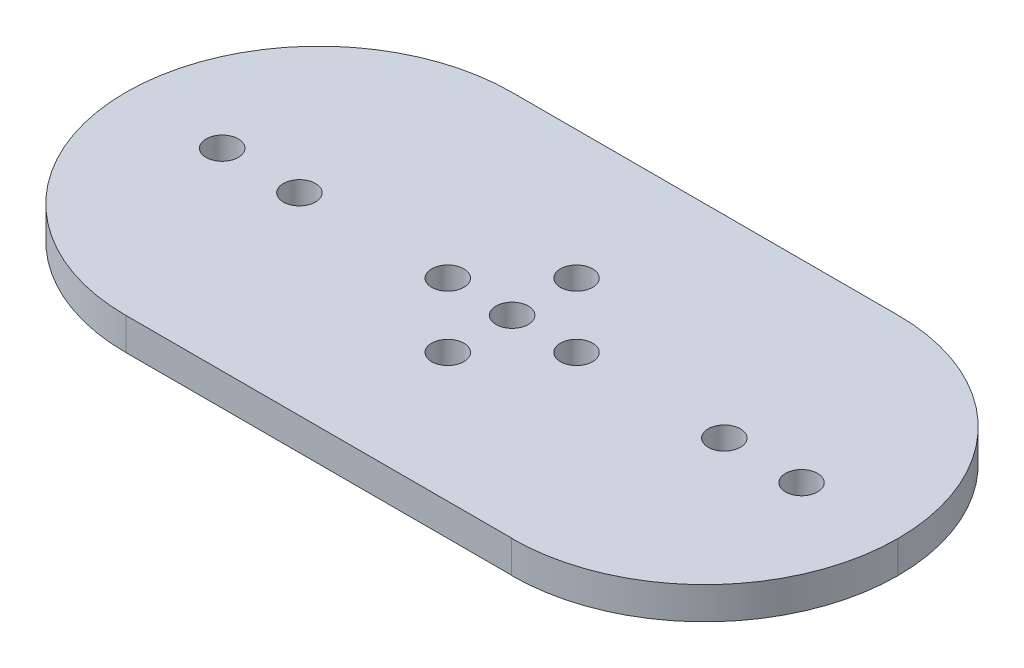
ISO-10303-21;
HEADER;
FILE_DESCRIPTION(('STEP AP214'),'2;1');
FILE_NAME('part.step','',(''),(''),'','','');
FILE_SCHEMA(('AUTOMOTIVE_DESIGN { 1 0 10303 214 1 1 1 1 }'));
ENDSEC;
DATA;
#1=APPLICATION_CONTEXT('core data for automotive mechanical design processes');
#2=APPLICATION_PROTOCOL_DEFINITION('international standard','automotive_design',2000,#1);
#3=PRODUCT_CONTEXT('',#1,'mechanical');
#4=PRODUCT('Part','Part','',(#3));
#5=PRODUCT_RELATED_PRODUCT_CATEGORY('part','',(#4));
#6=PRODUCT_DEFINITION_FORMATION('','',#4);
#7=PRODUCT_DEFINITION_CONTEXT('part definition',#1,'design');
#8=PRODUCT_DEFINITION('design','',#6,#7);
#9=PRODUCT_DEFINITION_SHAPE('','',#8);
#10=(LENGTH_UNIT() NAMED_UNIT(*) SI_UNIT(.MILLI.,.METRE.));
#11=(NAMED_UNIT(*) PLANE_ANGLE_UNIT() SI_UNIT($,.RADIAN.));
#12=(NAMED_UNIT(*) SI_UNIT($,.STERADIAN.) SOLID_ANGLE_UNIT());
#13=UNCERTAINTY_MEASURE_WITH_UNIT(LENGTH_MEASURE(1.E-05),#10,'distance_accuracy_value','');
#14=(GEOMETRIC_REPRESENTATION_CONTEXT(3) GLOBAL_UNCERTAINTY_ASSIGNED_CONTEXT((#13)) GLOBAL_UNIT_ASSIGNED_CONTEXT((#10,
#11,#12)) REPRESENTATION_CONTEXT('',''));
#15=CARTESIAN_POINT('',(0.,0.,0.));
#16=DIRECTION('',(0.,0.,1.));
#17=DIRECTION('',(1.,0.,0.));
#18=AXIS2_PLACEMENT_3D('',#15,#16,#17);
#19=CARTESIAN_POINT('',(0.,5.,0.));
#20=DIRECTION('',(0.,-1.,0.));
#21=DIRECTION('',(0.,0.,-1.));
#22=AXIS2_PLACEMENT_3D('',#19,#20,#21);
#23=PLANE('',#22);
#24=CARTESIAN_POINT('',(0.,5.,-30.));
#25=DIRECTION('',(0.,-1.,0.));
#26=DIRECTION('',(0.,0.,-1.));
#27=AXIS2_PLACEMENT_3D('',#24,#25,#26);
#28=CIRCLE('',#27,30.);
#29=CARTESIAN_POINT('',(0.,5.,-60.));
#30=VERTEX_POINT('',#29);
#31=CARTESIAN_POINT('',(-30.,5.,-30.));
#32=VERTEX_POINT('',#31);
#33=EDGE_CURVE('E135',#30,#32,#28,.F.);
#34=ORIENTED_EDGE('',*,*,#33,.T.);
#35=CARTESIAN_POINT('',(0.,5.,-30.));
#36=DIRECTION('',(0.,-1.,0.));
#37=DIRECTION('',(0.,0.,-1.));
#38=AXIS2_PLACEMENT_3D('',#35,#36,#37);
#39=CIRCLE('',#38,30.);
#40=CARTESIAN_POINT('',(0.,5.,0.));
#41=VERTEX_POINT('',#40);
#42=EDGE_CURVE('E140',#32,#41,#39,.F.);
#43=ORIENTED_EDGE('',*,*,#42,.T.);
#44=DIRECTION('',(1.,0.,0.));
#45=VECTOR('',#44,1.);
#46=CARTESIAN_POINT('',(0.,5.,0.));
#47=LINE('',#46,#45);
#48=CARTESIAN_POINT('',(60.,5.,0.));
#49=VERTEX_POINT('',#48);
#50=EDGE_CURVE('E114',#41,#49,#47,.T.);
#51=ORIENTED_EDGE('',*,*,#50,.T.);
#52=DIRECTION('',(0.,0.,1.));
#53=VECTOR('',#52,1.);
#54=CARTESIAN_POINT('',(60.,5.,-60.));
#55=LINE('',#54,#53);
#56=CARTESIAN_POINT('',(60.,5.,0.0442050222638005));
#57=VERTEX_POINT('',#56);
#58=EDGE_CURVE('E110',#49,#57,#55,.T.);
#59=ORIENTED_EDGE('',*,*,#58,.T.);
#60=CARTESIAN_POINT('',(60.,5.,-29.9557949777362));
#61=DIRECTION('',(0.,-1.,0.));
#62=DIRECTION('',(0.,0.,-1.));
#63=AXIS2_PLACEMENT_3D('',#60,#61,#62);
#64=CIRCLE('',#63,30.);
#65=CARTESIAN_POINT('',(90.,5.,-29.9557949777362));
#66=VERTEX_POINT('',#65);
#67=EDGE_CURVE('E68',#57,#66,#64,.F.);
#68=ORIENTED_EDGE('',*,*,#67,.T.);
#69=DIRECTION('',(0.,0.,-1.));
#70=VECTOR('',#69,1.);
#71=CARTESIAN_POINT('',(90.,5.,-60.));
#72=LINE('',#71,#70);
#73=CARTESIAN_POINT('',(90.,5.,-30.));
#74=VERTEX_POINT('',#73);
#75=EDGE_CURVE('E119',#66,#74,#72,.T.);
#76=ORIENTED_EDGE('',*,*,#75,.T.);
#77=CARTESIAN_POINT('',(60.,5.,-30.));
#78=DIRECTION('',(0.,-1.,0.));
#79=DIRECTION('',(0.,0.,-1.));
#80=AXIS2_PLACEMENT_3D('',#77,#78,#79);
#81=CIRCLE('',#80,30.);
#82=CARTESIAN_POINT('',(60.,5.,-60.));
#83=VERTEX_POINT('',#82);
#84=EDGE_CURVE('E136',#74,#83,#81,.F.);
#85=ORIENTED_EDGE('',*,*,#84,.T.);
#86=DIRECTION('',(-1.,0.,0.));
#87=VECTOR('',#86,1.);
#88=CARTESIAN_POINT('',(0.,5.,-60.));
#89=LINE('',#88,#87);
#90=EDGE_CURVE('E162',#83,#30,#89,.T.);
#91=ORIENTED_EDGE('',*,*,#90,.T.);
#92=EDGE_LOOP('',(#34,#43,#51,#59,#68,#76,#85,#91));
#93=FACE_BOUND('',#92,.T.);
#94=CARTESIAN_POINT('',(30.,5.,-40.0206716755834));
#95=DIRECTION('',(0.,1.,0.));
#96=DIRECTION('',(0.,0.,1.));
#97=AXIS2_PLACEMENT_3D('',#94,#95,#96);
#98=CIRCLE('',#97,2.5);
#99=CARTESIAN_POINT('',(30.,5.,-37.5206716755834));
#100=VERTEX_POINT('',#99);
#101=EDGE_CURVE('E198',#100,#100,#98,.T.);
#102=ORIENTED_EDGE('',*,*,#101,.F.);
#103=EDGE_LOOP('',(#102));
#104=FACE_BOUND('',#103,.T.);
#105=CARTESIAN_POINT('',(20.,5.,-30.0206716755834));
#106=DIRECTION('',(0.,1.,0.));
#107=DIRECTION('',(0.,0.,1.));
#108=AXIS2_PLACEMENT_3D('',#105,#106,#107);
#109=CIRCLE('',#108,2.5);
#110=CARTESIAN_POINT('',(20.,5.,-27.5206716755834));
#111=VERTEX_POINT('',#110);
#112=EDGE_CURVE('E267',#111,#111,#109,.T.);
#113=ORIENTED_EDGE('',*,*,#112,.F.);
#114=EDGE_LOOP('',(#113));
#115=FACE_BOUND('',#114,.T.);
#116=CARTESIAN_POINT('',(30.,5.,-20.0206716755834));
#117=DIRECTION('',(0.,1.,0.));
#118=DIRECTION('',(0.,0.,1.));
#119=AXIS2_PLACEMENT_3D('',#116,#117,#118);
#120=CIRCLE('',#119,2.5);
#121=CARTESIAN_POINT('',(30.,5.,-17.5206716755834));
#122=VERTEX_POINT('',#121);
#123=EDGE_CURVE('E259',#122,#122,#120,.T.);
#124=ORIENTED_EDGE('',*,*,#123,.F.);
#125=EDGE_LOOP('',(#124));
#126=FACE_BOUND('',#125,.T.);
#127=CARTESIAN_POINT('',(40.,5.,-30.0206716755834));
#128=DIRECTION('',(0.,1.,0.));
#129=DIRECTION('',(0.,0.,1.));
#130=AXIS2_PLACEMENT_3D('',#127,#128,#129);
#131=CIRCLE('',#130,2.5);
#132=CARTESIAN_POINT('',(40.,5.,-27.5206716755834));
#133=VERTEX_POINT('',#132);
#134=EDGE_CURVE('E251',#133,#133,#131,.T.);
#135=ORIENTED_EDGE('',*,*,#134,.F.);
#136=EDGE_LOOP('',(#135));
#137=FACE_BOUND('',#136,.T.);
#138=CARTESIAN_POINT('',(30.,5.,-30.0206716755834));
#139=DIRECTION('',(0.,1.,0.));
#140=DIRECTION('',(0.,0.,1.));
#141=AXIS2_PLACEMENT_3D('',#138,#139,#140);
#142=CIRCLE('',#141,2.5);
#143=CARTESIAN_POINT('',(30.,5.,-27.5206716755834));
#144=VERTEX_POINT('',#143);
#145=EDGE_CURVE('E243',#144,#144,#142,.T.);
#146=ORIENTED_EDGE('',*,*,#145,.F.);
#147=EDGE_LOOP('',(#146));
#148=FACE_BOUND('',#147,.T.);
#149=CARTESIAN_POINT('',(63.,5.,-29.9778974888681));
#150=DIRECTION('',(0.,1.,0.));
#151=DIRECTION('',(0.,0.,1.));
#152=AXIS2_PLACEMENT_3D('',#149,#150,#151);
#153=CIRCLE('',#152,2.50000000000001);
#154=CARTESIAN_POINT('',(63.,5.,-27.4778974888681));
#155=VERTEX_POINT('',#154);
#156=EDGE_CURVE('E217',#155,#155,#153,.T.);
#157=ORIENTED_EDGE('',*,*,#156,.F.);
#158=EDGE_LOOP('',(#157));
#159=FACE_BOUND('',#158,.T.);
#160=CARTESIAN_POINT('',(75.,5.,-29.9778974888681));
#161=DIRECTION('',(0.,1.,0.));
#162=DIRECTION('',(0.,0.,1.));
#163=AXIS2_PLACEMENT_3D('',#160,#161,#162);
#164=CIRCLE('',#163,2.5);
#165=CARTESIAN_POINT('',(75.,5.,-27.4778974888681));
#166=VERTEX_POINT('',#165);
#167=EDGE_CURVE('E368',#166,#166,#164,.T.);
#168=ORIENTED_EDGE('',*,*,#167,.F.);
#169=EDGE_LOOP('',(#168));
#170=FACE_BOUND('',#169,.T.);
#171=CARTESIAN_POINT('',(-3.,5.,-29.9778974888681));
#172=DIRECTION('',(0.,1.,0.));
#173=DIRECTION('',(0.,0.,1.));
#174=AXIS2_PLACEMENT_3D('',#171,#172,#173);
#175=CIRCLE('',#174,2.5);
#176=CARTESIAN_POINT('',(-3.,5.,-27.4778974888681));
#177=VERTEX_POINT('',#176);
#178=EDGE_CURVE('E180',#177,#177,#175,.T.);
#179=ORIENTED_EDGE('',*,*,#178,.F.);
#180=EDGE_LOOP('',(#179));
#181=FACE_BOUND('',#180,.T.);
#182=CARTESIAN_POINT('',(-15.,5.,-29.9778974888681));
#183=DIRECTION('',(0.,1.,0.));
#184=DIRECTION('',(0.,0.,1.));
#185=AXIS2_PLACEMENT_3D('',#182,#183,#184);
#186=CIRCLE('',#185,2.5);
#187=CARTESIAN_POINT('',(-15.,5.,-27.4778974888681));
#188=VERTEX_POINT('',#187);
#189=EDGE_CURVE('E231',#188,#188,#186,.T.);
#190=ORIENTED_EDGE('',*,*,#189,.F.);
#191=EDGE_LOOP('',(#190));
#192=FACE_BOUND('',#191,.T.);
#193=ADVANCED_FACE('F45',(#93,#104,#115,#126,#137,#148,#159,#170,#181,#192),#23,.F.);
#194=CARTESIAN_POINT('',(0.,0.,0.));
#195=DIRECTION('',(0.,-1.,0.));
#196=DIRECTION('',(0.,0.,-1.));
#197=AXIS2_PLACEMENT_3D('',#194,#195,#196);
#198=PLANE('',#197);
#199=CARTESIAN_POINT('',(40.,0.,-30.0206716755834));
#200=DIRECTION('',(0.,1.,0.));
#201=DIRECTION('',(0.,0.,1.));
#202=AXIS2_PLACEMENT_3D('',#199,#200,#201);
#203=CIRCLE('',#202,2.5);
#204=CARTESIAN_POINT('',(40.,0.,-27.5206716755834));
#205=VERTEX_POINT('',#204);
#206=EDGE_CURVE('E247',#205,#205,#203,.T.);
#207=ORIENTED_EDGE('',*,*,#206,.T.);
#208=EDGE_LOOP('',(#207));
#209=FACE_BOUND('',#208,.T.);
#210=CARTESIAN_POINT('',(20.,0.,-30.0206716755834));
#211=DIRECTION('',(0.,1.,0.));
#212=DIRECTION('',(0.,0.,1.));
#213=AXIS2_PLACEMENT_3D('',#210,#211,#212);
#214=CIRCLE('',#213,2.5);
#215=CARTESIAN_POINT('',(20.,0.,-27.5206716755834));
#216=VERTEX_POINT('',#215);
#217=EDGE_CURVE('E263',#216,#216,#214,.T.);
#218=ORIENTED_EDGE('',*,*,#217,.T.);
#219=EDGE_LOOP('',(#218));
#220=FACE_BOUND('',#219,.T.);
#221=DIRECTION('',(1.,0.,0.));
#222=VECTOR('',#221,1.);
#223=CARTESIAN_POINT('',(0.,0.,0.));
#224=LINE('',#223,#222);
#225=CARTESIAN_POINT('',(0.,0.,0.));
#226=VERTEX_POINT('',#225);
#227=CARTESIAN_POINT('',(60.,0.,0.));
#228=VERTEX_POINT('',#227);
#229=EDGE_CURVE('E191',#226,#228,#224,.T.);
#230=ORIENTED_EDGE('',*,*,#229,.F.);
#231=CARTESIAN_POINT('',(0.,0.,-30.));
#232=DIRECTION('',(0.,-1.,0.));
#233=DIRECTION('',(0.,0.,-1.));
#234=AXIS2_PLACEMENT_3D('',#231,#232,#233);
#235=CIRCLE('',#234,30.);
#236=CARTESIAN_POINT('',(-30.,0.,-30.));
#237=VERTEX_POINT('',#236);
#238=EDGE_CURVE('E142',#226,#237,#235,.T.);
#239=ORIENTED_EDGE('',*,*,#238,.T.);
#240=CARTESIAN_POINT('',(0.,0.,-30.));
#241=DIRECTION('',(0.,-1.,0.));
#242=DIRECTION('',(0.,0.,-1.));
#243=AXIS2_PLACEMENT_3D('',#240,#241,#242);
#244=CIRCLE('',#243,30.);
#245=CARTESIAN_POINT('',(0.,0.,-60.));
#246=VERTEX_POINT('',#245);
#247=EDGE_CURVE('E177',#237,#246,#244,.T.);
#248=ORIENTED_EDGE('',*,*,#247,.T.);
#249=DIRECTION('',(-1.,0.,0.));
#250=VECTOR('',#249,1.);
#251=CARTESIAN_POINT('',(0.,0.,-60.));
#252=LINE('',#251,#250);
#253=CARTESIAN_POINT('',(60.,0.,-60.));
#254=VERTEX_POINT('',#253);
#255=EDGE_CURVE('E165',#254,#246,#252,.T.);
#256=ORIENTED_EDGE('',*,*,#255,.F.);
#257=CARTESIAN_POINT('',(60.,0.,-30.));
#258=DIRECTION('',(0.,-1.,0.));
#259=DIRECTION('',(0.,0.,-1.));
#260=AXIS2_PLACEMENT_3D('',#257,#258,#259);
#261=CIRCLE('',#260,30.);
#262=CARTESIAN_POINT('',(90.,0.,-30.));
#263=VERTEX_POINT('',#262);
#264=EDGE_CURVE('E204',#254,#263,#261,.T.);
#265=ORIENTED_EDGE('',*,*,#264,.T.);
#266=DIRECTION('',(0.,0.,-1.));
#267=VECTOR('',#266,1.);
#268=CARTESIAN_POINT('',(90.,0.,-60.));
#269=LINE('',#268,#267);
#270=CARTESIAN_POINT('',(90.,0.,-29.9557949777362));
#271=VERTEX_POINT('',#270);
#272=EDGE_CURVE('E120',#271,#263,#269,.T.);
#273=ORIENTED_EDGE('',*,*,#272,.F.);
#274=CARTESIAN_POINT('',(60.,0.,-29.9557949777362));
#275=DIRECTION('',(0.,-1.,0.));
#276=DIRECTION('',(0.,0.,-1.));
#277=AXIS2_PLACEMENT_3D('',#274,#275,#276);
#278=CIRCLE('',#277,30.);
#279=CARTESIAN_POINT('',(60.,0.,0.0442050222638005));
#280=VERTEX_POINT('',#279);
#281=EDGE_CURVE('E207',#271,#280,#278,.T.);
#282=ORIENTED_EDGE('',*,*,#281,.T.);
#283=DIRECTION('',(0.,0.,1.));
#284=VECTOR('',#283,1.);
#285=CARTESIAN_POINT('',(60.,0.,-60.));
#286=LINE('',#285,#284);
#287=EDGE_CURVE('E127',#228,#280,#286,.T.);
#288=ORIENTED_EDGE('',*,*,#287,.F.);
#289=EDGE_LOOP('',(#230,#239,#248,#256,#265,#273,#282,#288));
#290=FACE_BOUND('',#289,.T.);
#291=CARTESIAN_POINT('',(30.,0.,-40.0206716755834));
#292=DIRECTION('',(0.,1.,0.));
#293=DIRECTION('',(0.,0.,1.));
#294=AXIS2_PLACEMENT_3D('',#291,#292,#293);
#295=CIRCLE('',#294,2.5);
#296=CARTESIAN_POINT('',(30.,0.,-37.5206716755834));
#297=VERTEX_POINT('',#296);
#298=EDGE_CURVE('E194',#297,#297,#295,.T.);
#299=ORIENTED_EDGE('',*,*,#298,.T.);
#300=EDGE_LOOP('',(#299));
#301=FACE_BOUND('',#300,.T.);
#302=CARTESIAN_POINT('',(30.,0.,-20.0206716755834));
#303=DIRECTION('',(0.,1.,0.));
#304=DIRECTION('',(0.,0.,1.));
#305=AXIS2_PLACEMENT_3D('',#302,#303,#304);
#306=CIRCLE('',#305,2.5);
#307=CARTESIAN_POINT('',(30.,0.,-17.5206716755834));
#308=VERTEX_POINT('',#307);
#309=EDGE_CURVE('E255',#308,#308,#306,.T.);
#310=ORIENTED_EDGE('',*,*,#309,.T.);
#311=EDGE_LOOP('',(#310));
#312=FACE_BOUND('',#311,.T.);
#313=CARTESIAN_POINT('',(30.,0.,-30.0206716755834));
#314=DIRECTION('',(0.,1.,0.));
#315=DIRECTION('',(0.,0.,1.));
#316=AXIS2_PLACEMENT_3D('',#313,#314,#315);
#317=CIRCLE('',#316,2.5);
#318=CARTESIAN_POINT('',(30.,0.,-27.5206716755834));
#319=VERTEX_POINT('',#318);
#320=EDGE_CURVE('E130',#319,#319,#317,.T.);
#321=ORIENTED_EDGE('',*,*,#320,.T.);
#322=EDGE_LOOP('',(#321));
#323=FACE_BOUND('',#322,.T.);
#324=CARTESIAN_POINT('',(63.,0.,-29.9778974888681));
#325=DIRECTION('',(0.,1.,0.));
#326=DIRECTION('',(0.,0.,1.));
#327=AXIS2_PLACEMENT_3D('',#324,#325,#326);
#328=CIRCLE('',#327,2.50000000000001);
#329=CARTESIAN_POINT('',(63.,0.,-27.4778974888681));
#330=VERTEX_POINT('',#329);
#331=EDGE_CURVE('E223',#330,#330,#328,.T.);
#332=ORIENTED_EDGE('',*,*,#331,.T.);
#333=EDGE_LOOP('',(#332));
#334=FACE_BOUND('',#333,.T.);
#335=CARTESIAN_POINT('',(75.,0.,-29.9778974888681));
#336=DIRECTION('',(0.,1.,0.));
#337=DIRECTION('',(0.,0.,1.));
#338=AXIS2_PLACEMENT_3D('',#335,#336,#337);
#339=CIRCLE('',#338,2.5);
#340=CARTESIAN_POINT('',(75.,0.,-27.4778974888681));
#341=VERTEX_POINT('',#340);
#342=EDGE_CURVE('E239',#341,#341,#339,.T.);
#343=ORIENTED_EDGE('',*,*,#342,.T.);
#344=EDGE_LOOP('',(#343));
#345=FACE_BOUND('',#344,.T.);
#346=CARTESIAN_POINT('',(-3.,0.,-29.9778974888681));
#347=DIRECTION('',(0.,1.,0.));
#348=DIRECTION('',(0.,0.,1.));
#349=AXIS2_PLACEMENT_3D('',#346,#347,#348);
#350=CIRCLE('',#349,2.5);
#351=CARTESIAN_POINT('',(-3.,0.,-27.4778974888681));
#352=VERTEX_POINT('',#351);
#353=EDGE_CURVE('E227',#352,#352,#350,.T.);
#354=ORIENTED_EDGE('',*,*,#353,.T.);
#355=EDGE_LOOP('',(#354));
#356=FACE_BOUND('',#355,.T.);
#357=CARTESIAN_POINT('',(-15.,0.,-29.9778974888681));
#358=DIRECTION('',(0.,1.,0.));
#359=DIRECTION('',(0.,0.,1.));
#360=AXIS2_PLACEMENT_3D('',#357,#358,#359);
#361=CIRCLE('',#360,2.5);
#362=CARTESIAN_POINT('',(-15.,0.,-27.4778974888681));
#363=VERTEX_POINT('',#362);
#364=EDGE_CURVE('E235',#363,#363,#361,.T.);
#365=ORIENTED_EDGE('',*,*,#364,.T.);
#366=EDGE_LOOP('',(#365));
#367=FACE_BOUND('',#366,.T.);
#368=ADVANCED_FACE('F213',(#209,#220,#290,#301,#312,#323,#334,#345,#356,#367),#198,.T.);
#369=CARTESIAN_POINT('',(0.,5.,0.));
#370=DIRECTION('',(0.,0.,-1.));
#371=DIRECTION('',(-1.,0.,0.));
#372=AXIS2_PLACEMENT_3D('',#369,#370,#371);
#373=PLANE('',#372);
#374=ORIENTED_EDGE('',*,*,#50,.F.);
#375=DIRECTION('',(0.,-1.,0.));
#376=VECTOR('',#375,1.);
#377=CARTESIAN_POINT('',(0.,5.,0.));
#378=LINE('',#377,#376);
#379=EDGE_CURVE('E184',#41,#226,#378,.T.);
#380=ORIENTED_EDGE('',*,*,#379,.T.);
#381=ORIENTED_EDGE('',*,*,#229,.T.);
#382=DIRECTION('',(0.,-1.,0.));
#383=VECTOR('',#382,1.);
#384=CARTESIAN_POINT('',(60.,5.,0.));
#385=LINE('',#384,#383);
#386=EDGE_CURVE('E172',#49,#228,#385,.T.);
#387=ORIENTED_EDGE('',*,*,#386,.F.);
#388=EDGE_LOOP('',(#374,#380,#381,#387));
#389=FACE_BOUND('',#388,.T.);
#390=ADVANCED_FACE('F186',(#389),#373,.F.);
#391=CARTESIAN_POINT('',(0.,5.,-60.));
#392=DIRECTION('',(0.,0.,1.));
#393=DIRECTION('',(1.,0.,0.));
#394=AXIS2_PLACEMENT_3D('',#391,#392,#393);
#395=PLANE('',#394);
#396=ORIENTED_EDGE('',*,*,#255,.T.);
#397=DIRECTION('',(0.,-1.,0.));
#398=VECTOR('',#397,1.);
#399=CARTESIAN_POINT('',(0.,5.,-60.));
#400=LINE('',#399,#398);
#401=EDGE_CURVE('E152',#246,#30,#400,.F.);
#402=ORIENTED_EDGE('',*,*,#401,.T.);
#403=ORIENTED_EDGE('',*,*,#90,.F.);
#404=DIRECTION('',(0.,-1.,0.));
#405=VECTOR('',#404,1.);
#406=CARTESIAN_POINT('',(60.,5.,-60.));
#407=LINE('',#406,#405);
#408=EDGE_CURVE('E148',#83,#254,#407,.T.);
#409=ORIENTED_EDGE('',*,*,#408,.T.);
#410=EDGE_LOOP('',(#396,#402,#403,#409));
#411=FACE_BOUND('',#410,.T.);
#412=ADVANCED_FACE('F161',(#411),#395,.F.);
#413=CARTESIAN_POINT('',(30.,5.,-40.0206716755834));
#414=DIRECTION('',(0.,-1.,0.));
#415=DIRECTION('',(0.,0.,-1.));
#416=AXIS2_PLACEMENT_3D('',#413,#414,#415);
#417=CYLINDRICAL_SURFACE('',#416,2.5);
#418=ORIENTED_EDGE('',*,*,#101,.T.);
#419=EDGE_LOOP('',(#418));
#420=FACE_BOUND('',#419,.T.);
#421=ORIENTED_EDGE('',*,*,#298,.F.);
#422=EDGE_LOOP('',(#421));
#423=FACE_BOUND('',#422,.T.);
#424=ADVANCED_FACE('F282',(#420,#423),#417,.F.);
#425=CARTESIAN_POINT('',(20.,5.,-30.0206716755834));
#426=DIRECTION('',(0.,-1.,0.));
#427=DIRECTION('',(0.,0.,-1.));
#428=AXIS2_PLACEMENT_3D('',#425,#426,#427);
#429=CYLINDRICAL_SURFACE('',#428,2.5);
#430=ORIENTED_EDGE('',*,*,#112,.T.);
#431=EDGE_LOOP('',(#430));
#432=FACE_BOUND('',#431,.T.);
#433=ORIENTED_EDGE('',*,*,#217,.F.);
#434=EDGE_LOOP('',(#433));
#435=FACE_BOUND('',#434,.T.);
#436=ADVANCED_FACE('F284',(#432,#435),#429,.F.);
#437=CARTESIAN_POINT('',(30.,5.,-20.0206716755834));
#438=DIRECTION('',(0.,-1.,0.));
#439=DIRECTION('',(0.,0.,-1.));
#440=AXIS2_PLACEMENT_3D('',#437,#438,#439);
#441=CYLINDRICAL_SURFACE('',#440,2.5);
#442=ORIENTED_EDGE('',*,*,#123,.T.);
#443=EDGE_LOOP('',(#442));
#444=FACE_BOUND('',#443,.T.);
#445=ORIENTED_EDGE('',*,*,#309,.F.);
#446=EDGE_LOOP('',(#445));
#447=FACE_BOUND('',#446,.T.);
#448=ADVANCED_FACE('F289',(#444,#447),#441,.F.);
#449=CARTESIAN_POINT('',(40.,5.,-30.0206716755834));
#450=DIRECTION('',(0.,-1.,0.));
#451=DIRECTION('',(0.,0.,-1.));
#452=AXIS2_PLACEMENT_3D('',#449,#450,#451);
#453=CYLINDRICAL_SURFACE('',#452,2.5);
#454=ORIENTED_EDGE('',*,*,#134,.T.);
#455=EDGE_LOOP('',(#454));
#456=FACE_BOUND('',#455,.T.);
#457=ORIENTED_EDGE('',*,*,#206,.F.);
#458=EDGE_LOOP('',(#457));
#459=FACE_BOUND('',#458,.T.);
#460=ADVANCED_FACE('F340',(#456,#459),#453,.F.);
#461=CARTESIAN_POINT('',(30.,5.,-30.0206716755834));
#462=DIRECTION('',(0.,-1.,0.));
#463=DIRECTION('',(0.,0.,-1.));
#464=AXIS2_PLACEMENT_3D('',#461,#462,#463);
#465=CYLINDRICAL_SURFACE('',#464,2.5);
#466=ORIENTED_EDGE('',*,*,#145,.T.);
#467=EDGE_LOOP('',(#466));
#468=FACE_BOUND('',#467,.T.);
#469=ORIENTED_EDGE('',*,*,#320,.F.);
#470=EDGE_LOOP('',(#469));
#471=FACE_BOUND('',#470,.T.);
#472=ADVANCED_FACE('F328',(#468,#471),#465,.F.);
#473=CARTESIAN_POINT('',(60.,5.,-60.));
#474=DIRECTION('',(1.,0.,0.));
#475=DIRECTION('',(0.,0.,-1.));
#476=AXIS2_PLACEMENT_3D('',#473,#474,#475);
#477=PLANE('',#476);
#478=ORIENTED_EDGE('',*,*,#58,.F.);
#479=ORIENTED_EDGE('',*,*,#386,.T.);
#480=ORIENTED_EDGE('',*,*,#287,.T.);
#481=DIRECTION('',(0.,-1.,0.));
#482=VECTOR('',#481,1.);
#483=CARTESIAN_POINT('',(60.,5.,0.0442050222638005));
#484=LINE('',#483,#482);
#485=EDGE_CURVE('E124',#57,#280,#484,.T.);
#486=ORIENTED_EDGE('',*,*,#485,.F.);
#487=EDGE_LOOP('',(#478,#479,#480,#486));
#488=FACE_BOUND('',#487,.T.);
#489=ADVANCED_FACE('F125',(#488),#477,.F.);
#490=CARTESIAN_POINT('',(90.,5.,-60.));
#491=DIRECTION('',(-1.,0.,0.));
#492=DIRECTION('',(0.,0.,1.));
#493=AXIS2_PLACEMENT_3D('',#490,#491,#492);
#494=PLANE('',#493);
#495=ORIENTED_EDGE('',*,*,#75,.F.);
#496=DIRECTION('',(0.,-1.,0.));
#497=VECTOR('',#496,1.);
#498=CARTESIAN_POINT('',(90.,5.,-29.9557949777362));
#499=LINE('',#498,#497);
#500=EDGE_CURVE('E11',#66,#271,#499,.T.);
#501=ORIENTED_EDGE('',*,*,#500,.T.);
#502=ORIENTED_EDGE('',*,*,#272,.T.);
#503=DIRECTION('',(0.,-1.,0.));
#504=VECTOR('',#503,1.);
#505=CARTESIAN_POINT('',(90.,5.,-30.));
#506=LINE('',#505,#504);
#507=EDGE_CURVE('E55',#263,#74,#506,.F.);
#508=ORIENTED_EDGE('',*,*,#507,.T.);
#509=EDGE_LOOP('',(#495,#501,#502,#508));
#510=FACE_BOUND('',#509,.T.);
#511=ADVANCED_FACE('F316',(#510),#494,.F.);
#512=CARTESIAN_POINT('',(63.,5.,-29.9778974888681));
#513=DIRECTION('',(0.,-1.,0.));
#514=DIRECTION('',(0.,0.,-1.));
#515=AXIS2_PLACEMENT_3D('',#512,#513,#514);
#516=CYLINDRICAL_SURFACE('',#515,2.50000000000001);
#517=ORIENTED_EDGE('',*,*,#156,.T.);
#518=EDGE_LOOP('',(#517));
#519=FACE_BOUND('',#518,.T.);
#520=ORIENTED_EDGE('',*,*,#331,.F.);
#521=EDGE_LOOP('',(#520));
#522=FACE_BOUND('',#521,.T.);
#523=ADVANCED_FACE('F319',(#519,#522),#516,.F.);
#524=CARTESIAN_POINT('',(75.,5.,-29.9778974888681));
#525=DIRECTION('',(0.,-1.,0.));
#526=DIRECTION('',(0.,0.,-1.));
#527=AXIS2_PLACEMENT_3D('',#524,#525,#526);
#528=CYLINDRICAL_SURFACE('',#527,2.5);
#529=ORIENTED_EDGE('',*,*,#167,.T.);
#530=EDGE_LOOP('',(#529));
#531=FACE_BOUND('',#530,.T.);
#532=ORIENTED_EDGE('',*,*,#342,.F.);
#533=EDGE_LOOP('',(#532));
#534=FACE_BOUND('',#533,.T.);
#535=ADVANCED_FACE('F325',(#531,#534),#528,.F.);
#536=CARTESIAN_POINT('',(-3.,5.,-29.9778974888681));
#537=DIRECTION('',(0.,-1.,0.));
#538=DIRECTION('',(0.,0.,-1.));
#539=AXIS2_PLACEMENT_3D('',#536,#537,#538);
#540=CYLINDRICAL_SURFACE('',#539,2.5);
#541=ORIENTED_EDGE('',*,*,#178,.T.);
#542=EDGE_LOOP('',(#541));
#543=FACE_BOUND('',#542,.T.);
#544=ORIENTED_EDGE('',*,*,#353,.F.);
#545=EDGE_LOOP('',(#544));
#546=FACE_BOUND('',#545,.T.);
#547=ADVANCED_FACE('F332',(#543,#546),#540,.F.);
#548=CARTESIAN_POINT('',(-15.,5.,-29.9778974888681));
#549=DIRECTION('',(0.,-1.,0.));
#550=DIRECTION('',(0.,0.,-1.));
#551=AXIS2_PLACEMENT_3D('',#548,#549,#550);
#552=CYLINDRICAL_SURFACE('',#551,2.5);
#553=ORIENTED_EDGE('',*,*,#189,.T.);
#554=EDGE_LOOP('',(#553));
#555=FACE_BOUND('',#554,.T.);
#556=ORIENTED_EDGE('',*,*,#364,.F.);
#557=EDGE_LOOP('',(#556));
#558=FACE_BOUND('',#557,.T.);
#559=ADVANCED_FACE('F308',(#555,#558),#552,.F.);
#560=CARTESIAN_POINT('',(0.,5.,-30.));
#561=DIRECTION('',(0.,-1.,0.));
#562=DIRECTION('',(0.,0.,-1.));
#563=AXIS2_PLACEMENT_3D('',#560,#561,#562);
#564=CYLINDRICAL_SURFACE('',#563,30.);
#565=DIRECTION('',(0.,-1.,0.));
#566=VECTOR('',#565,1.);
#567=CARTESIAN_POINT('',(-30.,5.,-30.));
#568=LINE('',#567,#566);
#569=EDGE_CURVE('E49',#32,#237,#568,.T.);
#570=ORIENTED_EDGE('',*,*,#569,.F.);
#571=ORIENTED_EDGE('',*,*,#33,.F.);
#572=ORIENTED_EDGE('',*,*,#401,.F.);
#573=ORIENTED_EDGE('',*,*,#247,.F.);
#574=EDGE_LOOP('',(#570,#571,#572,#573));
#575=FACE_BOUND('',#574,.T.);
#576=ADVANCED_FACE('F174',(#575),#564,.T.);
#577=CARTESIAN_POINT('',(0.,5.,-30.));
#578=DIRECTION('',(0.,-1.,0.));
#579=DIRECTION('',(0.,0.,-1.));
#580=AXIS2_PLACEMENT_3D('',#577,#578,#579);
#581=CYLINDRICAL_SURFACE('',#580,30.);
#582=ORIENTED_EDGE('',*,*,#42,.F.);
#583=ORIENTED_EDGE('',*,*,#569,.T.);
#584=ORIENTED_EDGE('',*,*,#238,.F.);
#585=ORIENTED_EDGE('',*,*,#379,.F.);
#586=EDGE_LOOP('',(#582,#583,#584,#585));
#587=FACE_BOUND('',#586,.T.);
#588=ADVANCED_FACE('F182',(#587),#581,.T.);
#589=CARTESIAN_POINT('',(60.,5.,-29.9557949777362));
#590=DIRECTION('',(0.,-1.,0.));
#591=DIRECTION('',(0.,0.,-1.));
#592=AXIS2_PLACEMENT_3D('',#589,#590,#591);
#593=CYLINDRICAL_SURFACE('',#592,30.);
#594=ORIENTED_EDGE('',*,*,#67,.F.);
#595=ORIENTED_EDGE('',*,*,#485,.T.);
#596=ORIENTED_EDGE('',*,*,#281,.F.);
#597=ORIENTED_EDGE('',*,*,#500,.F.);
#598=EDGE_LOOP('',(#594,#595,#596,#597));
#599=FACE_BOUND('',#598,.T.);
#600=ADVANCED_FACE('F133',(#599),#593,.T.);
#601=CARTESIAN_POINT('',(60.,5.,-30.));
#602=DIRECTION('',(0.,-1.,0.));
#603=DIRECTION('',(0.,0.,-1.));
#604=AXIS2_PLACEMENT_3D('',#601,#602,#603);
#605=CYLINDRICAL_SURFACE('',#604,30.);
#606=ORIENTED_EDGE('',*,*,#84,.F.);
#607=ORIENTED_EDGE('',*,*,#507,.F.);
#608=ORIENTED_EDGE('',*,*,#264,.F.);
#609=ORIENTED_EDGE('',*,*,#408,.F.);
#610=EDGE_LOOP('',(#606,#607,#608,#609));
#611=FACE_BOUND('',#610,.T.);
#612=ADVANCED_FACE('F47',(#611),#605,.T.);
#613=CLOSED_SHELL('',(#193,#368,#390,#412,#424,#436,#448,#460,#472,#489,#511,#523,#535,#547,
#559,#576,#588,#600,#612));
#614=MANIFOLD_SOLID_BREP('B2',#613);
#615=ADVANCED_BREP_SHAPE_REPRESENTATION('',(#18,#614),#14);
#616=SHAPE_DEFINITION_REPRESENTATION(#9,#615);
ENDSEC;
END-ISO-10303-21;
